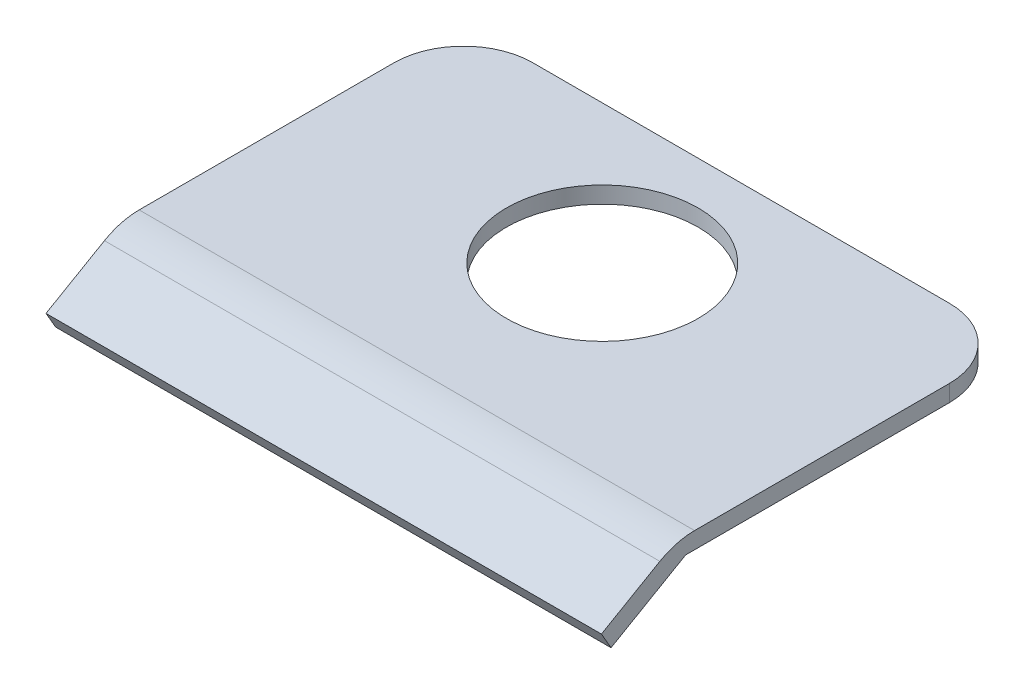
ISO-10303-21;
HEADER;
FILE_DESCRIPTION(('STEP AP214'),'2;1');
FILE_NAME('part.step','',(''),(''),'','','');
FILE_SCHEMA(('AUTOMOTIVE_DESIGN { 1 0 10303 214 1 1 1 1 }'));
ENDSEC;
DATA;
#1=APPLICATION_CONTEXT('core data for automotive mechanical design processes');
#2=APPLICATION_PROTOCOL_DEFINITION('international standard','automotive_design',2000,#1);
#3=PRODUCT_CONTEXT('',#1,'mechanical');
#4=PRODUCT('Part','Part','',(#3));
#5=PRODUCT_RELATED_PRODUCT_CATEGORY('part','',(#4));
#6=PRODUCT_DEFINITION_FORMATION('','',#4);
#7=PRODUCT_DEFINITION_CONTEXT('part definition',#1,'design');
#8=PRODUCT_DEFINITION('design','',#6,#7);
#9=PRODUCT_DEFINITION_SHAPE('','',#8);
#10=(LENGTH_UNIT() NAMED_UNIT(*) SI_UNIT(.MILLI.,.METRE.));
#11=(NAMED_UNIT(*) PLANE_ANGLE_UNIT() SI_UNIT($,.RADIAN.));
#12=(NAMED_UNIT(*) SI_UNIT($,.STERADIAN.) SOLID_ANGLE_UNIT());
#13=UNCERTAINTY_MEASURE_WITH_UNIT(LENGTH_MEASURE(1.E-05),#10,'distance_accuracy_value','');
#14=(GEOMETRIC_REPRESENTATION_CONTEXT(3) GLOBAL_UNCERTAINTY_ASSIGNED_CONTEXT((#13)) GLOBAL_UNIT_ASSIGNED_CONTEXT((#10,
#11,#12)) REPRESENTATION_CONTEXT('',''));
#15=CARTESIAN_POINT('',(0.,0.,0.));
#16=DIRECTION('',(0.,0.,1.));
#17=DIRECTION('',(1.,0.,0.));
#18=AXIS2_PLACEMENT_3D('',#15,#16,#17);
#19=CARTESIAN_POINT('',(0.,1.524,0.));
#20=DIRECTION('',(0.,1.,0.));
#21=DIRECTION('',(0.,0.,1.));
#22=AXIS2_PLACEMENT_3D('',#19,#20,#21);
#23=PLANE('',#22);
#24=DIRECTION('',(0.,0.,1.));
#25=VECTOR('',#24,1.);
#26=CARTESIAN_POINT('',(-25.4,1.524,-15.24));
#27=LINE('',#26,#25);
#28=CARTESIAN_POINT('',(-25.4,1.524,-8.89));
#29=VERTEX_POINT('',#28);
#30=CARTESIAN_POINT('',(-25.4,1.524,14.4184044383074));
#31=VERTEX_POINT('',#30);
#32=EDGE_CURVE('E164',#29,#31,#27,.T.);
#33=ORIENTED_EDGE('',*,*,#32,.T.);
#34=DIRECTION('',(-1.,0.,0.));
#35=VECTOR('',#34,1.);
#36=CARTESIAN_POINT('',(0.,1.524,14.4184044383074));
#37=LINE('',#36,#35);
#38=CARTESIAN_POINT('',(25.4,1.524,14.4184044383073));
#39=VERTEX_POINT('',#38);
#40=EDGE_CURVE('E179',#31,#39,#37,.F.);
#41=ORIENTED_EDGE('',*,*,#40,.T.);
#42=DIRECTION('',(0.,0.,-1.));
#43=VECTOR('',#42,1.);
#44=CARTESIAN_POINT('',(25.4,1.524,-15.24));
#45=LINE('',#44,#43);
#46=CARTESIAN_POINT('',(25.4,1.524,-8.89000000000001));
#47=VERTEX_POINT('',#46);
#48=EDGE_CURVE('E132',#39,#47,#45,.T.);
#49=ORIENTED_EDGE('',*,*,#48,.T.);
#50=CARTESIAN_POINT('',(19.05,1.524,-8.89));
#51=DIRECTION('',(0.,1.,0.));
#52=DIRECTION('',(0.,0.,1.));
#53=AXIS2_PLACEMENT_3D('',#50,#51,#52);
#54=CIRCLE('',#53,6.35);
#55=CARTESIAN_POINT('',(19.05,1.524,-15.24));
#56=VERTEX_POINT('',#55);
#57=EDGE_CURVE('E175',#47,#56,#54,.T.);
#58=ORIENTED_EDGE('',*,*,#57,.T.);
#59=DIRECTION('',(-1.,0.,0.));
#60=VECTOR('',#59,1.);
#61=CARTESIAN_POINT('',(-25.4,1.524,-15.24));
#62=LINE('',#61,#60);
#63=CARTESIAN_POINT('',(-19.05,1.524,-15.24));
#64=VERTEX_POINT('',#63);
#65=EDGE_CURVE('E161',#56,#64,#62,.T.);
#66=ORIENTED_EDGE('',*,*,#65,.T.);
#67=CARTESIAN_POINT('',(-19.05,1.524,-8.89));
#68=DIRECTION('',(0.,1.,0.));
#69=DIRECTION('',(0.,0.,1.));
#70=AXIS2_PLACEMENT_3D('',#67,#68,#69);
#71=CIRCLE('',#70,6.35);
#72=EDGE_CURVE('E177',#64,#29,#71,.T.);
#73=ORIENTED_EDGE('',*,*,#72,.T.);
#74=EDGE_LOOP('',(#33,#41,#49,#58,#66,#73));
#75=FACE_BOUND('',#74,.T.);
#76=CARTESIAN_POINT('',(0.,1.524,-2.54));
#77=DIRECTION('',(0.,1.,0.));
#78=DIRECTION('',(0.,0.,1.));
#79=AXIS2_PLACEMENT_3D('',#76,#77,#78);
#80=CIRCLE('',#79,8.76299999999999);
#81=CARTESIAN_POINT('',(0.,1.524,-11.303));
#82=VERTEX_POINT('',#81);
#83=EDGE_CURVE('E154',#82,#82,#80,.T.);
#84=ORIENTED_EDGE('',*,*,#83,.F.);
#85=EDGE_LOOP('',(#84));
#86=FACE_BOUND('',#85,.T.);
#87=ADVANCED_FACE('F39',(#75,#86),#23,.T.);
#88=CARTESIAN_POINT('',(0.,0.,0.));
#89=DIRECTION('',(0.,1.,0.));
#90=DIRECTION('',(0.,0.,1.));
#91=AXIS2_PLACEMENT_3D('',#88,#89,#90);
#92=PLANE('',#91);
#93=DIRECTION('',(0.,0.,1.));
#94=VECTOR('',#93,1.);
#95=CARTESIAN_POINT('',(-25.4,0.,-15.24));
#96=LINE('',#95,#94);
#97=CARTESIAN_POINT('',(-25.4,0.,-8.89));
#98=VERTEX_POINT('',#97);
#99=CARTESIAN_POINT('',(-25.4,0.,15.24));
#100=VERTEX_POINT('',#99);
#101=EDGE_CURVE('E111',#98,#100,#96,.T.);
#102=ORIENTED_EDGE('',*,*,#101,.F.);
#103=CARTESIAN_POINT('',(-19.05,0.,-8.89));
#104=DIRECTION('',(0.,1.,0.));
#105=DIRECTION('',(0.,0.,1.));
#106=AXIS2_PLACEMENT_3D('',#103,#104,#105);
#107=CIRCLE('',#106,6.35);
#108=CARTESIAN_POINT('',(-19.05,0.,-15.24));
#109=VERTEX_POINT('',#108);
#110=EDGE_CURVE('E54',#98,#109,#107,.F.);
#111=ORIENTED_EDGE('',*,*,#110,.T.);
#112=DIRECTION('',(-1.,0.,0.));
#113=VECTOR('',#112,1.);
#114=CARTESIAN_POINT('',(-25.4,0.,-15.24));
#115=LINE('',#114,#113);
#116=CARTESIAN_POINT('',(19.05,0.,-15.24));
#117=VERTEX_POINT('',#116);
#118=EDGE_CURVE('E122',#117,#109,#115,.T.);
#119=ORIENTED_EDGE('',*,*,#118,.F.);
#120=CARTESIAN_POINT('',(19.05,0.,-8.89));
#121=DIRECTION('',(0.,1.,0.));
#122=DIRECTION('',(0.,0.,1.));
#123=AXIS2_PLACEMENT_3D('',#120,#121,#122);
#124=CIRCLE('',#123,6.35);
#125=CARTESIAN_POINT('',(25.4,0.,-8.89000000000001));
#126=VERTEX_POINT('',#125);
#127=EDGE_CURVE('E62',#117,#126,#124,.F.);
#128=ORIENTED_EDGE('',*,*,#127,.T.);
#129=DIRECTION('',(0.,0.,-1.));
#130=VECTOR('',#129,1.);
#131=CARTESIAN_POINT('',(25.4,0.,-15.24));
#132=LINE('',#131,#130);
#133=CARTESIAN_POINT('',(25.4,0.,15.24));
#134=VERTEX_POINT('',#133);
#135=EDGE_CURVE('E128',#134,#126,#132,.T.);
#136=ORIENTED_EDGE('',*,*,#135,.F.);
#137=DIRECTION('',(1.,0.,0.));
#138=VECTOR('',#137,1.);
#139=CARTESIAN_POINT('',(-25.4,0.,15.24));
#140=LINE('',#139,#138);
#141=EDGE_CURVE('E121',#100,#134,#140,.T.);
#142=ORIENTED_EDGE('',*,*,#141,.F.);
#143=EDGE_LOOP('',(#102,#111,#119,#128,#136,#142));
#144=FACE_BOUND('',#143,.T.);
#145=CARTESIAN_POINT('',(0.,0.,-2.54));
#146=DIRECTION('',(0.,1.,0.));
#147=DIRECTION('',(0.,0.,1.));
#148=AXIS2_PLACEMENT_3D('',#145,#146,#147);
#149=CIRCLE('',#148,8.76299999999999);
#150=CARTESIAN_POINT('',(0.,0.,-11.303));
#151=VERTEX_POINT('',#150);
#152=EDGE_CURVE('E153',#151,#151,#149,.T.);
#153=ORIENTED_EDGE('',*,*,#152,.T.);
#154=EDGE_LOOP('',(#153));
#155=FACE_BOUND('',#154,.T.);
#156=ADVANCED_FACE('F125',(#144,#155),#92,.F.);
#157=CARTESIAN_POINT('',(25.4,1.524,-15.24));
#158=DIRECTION('',(-1.,0.,0.));
#159=DIRECTION('',(0.,0.,1.));
#160=AXIS2_PLACEMENT_3D('',#157,#158,#159);
#161=PLANE('',#160);
#162=ORIENTED_EDGE('',*,*,#48,.F.);
#163=CARTESIAN_POINT('',(25.4,-4.826,14.4184044383074));
#164=DIRECTION('',(-1.,0.,0.));
#165=DIRECTION('',(0.,0.,1.));
#166=AXIS2_PLACEMENT_3D('',#163,#164,#165);
#167=CIRCLE('',#166,6.35);
#168=CARTESIAN_POINT('',(25.4,0.673261314031206,17.5934044383073));
#169=VERTEX_POINT('',#168);
#170=EDGE_CURVE('E183',#39,#169,#167,.F.);
#171=ORIENTED_EDGE('',*,*,#170,.T.);
#172=DIRECTION('',(0.,-0.499999999999995,0.866025403784442));
#173=VECTOR('',#172,1.);
#174=CARTESIAN_POINT('',(25.4,1.524,16.119881810245));
#175=LINE('',#174,#173);
#176=CARTESIAN_POINT('',(25.4,-2.41299999999996,22.9389658396437));
#177=VERTEX_POINT('',#176);
#178=EDGE_CURVE('E143',#169,#177,#175,.T.);
#179=ORIENTED_EDGE('',*,*,#178,.T.);
#180=DIRECTION('',(0.,-0.866025403784442,-0.499999999999995));
#181=VECTOR('',#180,1.);
#182=CARTESIAN_POINT('',(25.4,-3.93699999999995,22.0590840293987));
#183=LINE('',#182,#181);
#184=CARTESIAN_POINT('',(25.4,-3.93699999999995,22.0590840293987));
#185=VERTEX_POINT('',#184);
#186=EDGE_CURVE('E149',#177,#185,#183,.T.);
#187=ORIENTED_EDGE('',*,*,#186,.T.);
#188=DIRECTION('',(0.,0.499999999999994,-0.866025403784442));
#189=VECTOR('',#188,1.);
#190=CARTESIAN_POINT('',(25.4,0.,15.24));
#191=LINE('',#190,#189);
#192=EDGE_CURVE('E151',#185,#134,#191,.T.);
#193=ORIENTED_EDGE('',*,*,#192,.T.);
#194=ORIENTED_EDGE('',*,*,#135,.T.);
#195=DIRECTION('',(0.,-1.,0.));
#196=VECTOR('',#195,1.);
#197=CARTESIAN_POINT('',(25.4,1.524,-8.89));
#198=LINE('',#197,#196);
#199=EDGE_CURVE('E181',#126,#47,#198,.F.);
#200=ORIENTED_EDGE('',*,*,#199,.T.);
#201=EDGE_LOOP('',(#162,#171,#179,#187,#193,#194,#200));
#202=FACE_BOUND('',#201,.T.);
#203=ADVANCED_FACE('F193',(#202),#161,.F.);
#204=CARTESIAN_POINT('',(-25.4,1.524,-15.24));
#205=DIRECTION('',(0.,0.,1.));
#206=DIRECTION('',(1.,0.,0.));
#207=AXIS2_PLACEMENT_3D('',#204,#205,#206);
#208=PLANE('',#207);
#209=ORIENTED_EDGE('',*,*,#118,.T.);
#210=DIRECTION('',(0.,-1.,0.));
#211=VECTOR('',#210,1.);
#212=CARTESIAN_POINT('',(-19.05,1.524,-15.24));
#213=LINE('',#212,#211);
#214=EDGE_CURVE('E11',#109,#64,#213,.F.);
#215=ORIENTED_EDGE('',*,*,#214,.T.);
#216=ORIENTED_EDGE('',*,*,#65,.F.);
#217=DIRECTION('',(0.,-1.,0.));
#218=VECTOR('',#217,1.);
#219=CARTESIAN_POINT('',(19.05,1.524,-15.24));
#220=LINE('',#219,#218);
#221=EDGE_CURVE('E47',#56,#117,#220,.T.);
#222=ORIENTED_EDGE('',*,*,#221,.T.);
#223=EDGE_LOOP('',(#209,#215,#216,#222));
#224=FACE_BOUND('',#223,.T.);
#225=ADVANCED_FACE('F188',(#224),#208,.F.);
#226=CARTESIAN_POINT('',(-25.4,1.524,-15.24));
#227=DIRECTION('',(1.,0.,0.));
#228=DIRECTION('',(0.,0.,-1.));
#229=AXIS2_PLACEMENT_3D('',#226,#227,#228);
#230=PLANE('',#229);
#231=DIRECTION('',(0.,0.499999999999995,-0.866025403784442));
#232=VECTOR('',#231,1.);
#233=CARTESIAN_POINT('',(-25.4,1.524,16.119881810245));
#234=LINE('',#233,#232);
#235=CARTESIAN_POINT('',(-25.4,-2.41299999999996,22.9389658396437));
#236=VERTEX_POINT('',#235);
#237=CARTESIAN_POINT('',(-25.4,0.673261314031205,17.5934044383073));
#238=VERTEX_POINT('',#237);
#239=EDGE_CURVE('E140',#236,#238,#234,.T.);
#240=ORIENTED_EDGE('',*,*,#239,.T.);
#241=CARTESIAN_POINT('',(-25.4,-4.826,14.4184044383074));
#242=DIRECTION('',(1.,0.,0.));
#243=DIRECTION('',(0.,0.,-1.));
#244=AXIS2_PLACEMENT_3D('',#241,#242,#243);
#245=CIRCLE('',#244,6.35);
#246=EDGE_CURVE('E173',#238,#31,#245,.F.);
#247=ORIENTED_EDGE('',*,*,#246,.T.);
#248=ORIENTED_EDGE('',*,*,#32,.F.);
#249=DIRECTION('',(0.,-1.,0.));
#250=VECTOR('',#249,1.);
#251=CARTESIAN_POINT('',(-25.4,1.524,-8.89));
#252=LINE('',#251,#250);
#253=EDGE_CURVE('E120',#29,#98,#252,.T.);
#254=ORIENTED_EDGE('',*,*,#253,.T.);
#255=ORIENTED_EDGE('',*,*,#101,.T.);
#256=DIRECTION('',(0.,-0.499999999999994,0.866025403784442));
#257=VECTOR('',#256,1.);
#258=CARTESIAN_POINT('',(-25.4,0.,15.24));
#259=LINE('',#258,#257);
#260=CARTESIAN_POINT('',(-25.4,-3.93699999999995,22.0590840293987));
#261=VERTEX_POINT('',#260);
#262=EDGE_CURVE('E117',#100,#261,#259,.T.);
#263=ORIENTED_EDGE('',*,*,#262,.T.);
#264=DIRECTION('',(0.,0.866025403784442,0.499999999999994));
#265=VECTOR('',#264,1.);
#266=CARTESIAN_POINT('',(-25.4,-3.93699999999995,22.0590840293987));
#267=LINE('',#266,#265);
#268=EDGE_CURVE('E138',#261,#236,#267,.T.);
#269=ORIENTED_EDGE('',*,*,#268,.T.);
#270=EDGE_LOOP('',(#240,#247,#248,#254,#255,#263,#269));
#271=FACE_BOUND('',#270,.T.);
#272=ADVANCED_FACE('F114',(#271),#230,.F.);
#273=CARTESIAN_POINT('',(0.,1.524,-2.54));
#274=DIRECTION('',(0.,-1.,0.));
#275=DIRECTION('',(0.,0.,-1.));
#276=AXIS2_PLACEMENT_3D('',#273,#274,#275);
#277=CYLINDRICAL_SURFACE('',#276,8.76299999999999);
#278=CARTESIAN_POINT('',(0.,1.524,-11.303));
#279=CARTESIAN_POINT('',(0.,1.508125,-11.303));
#280=CARTESIAN_POINT('',(0.,1.49225,-11.303));
#281=CARTESIAN_POINT('',(0.,1.4605,-11.303));
#282=CARTESIAN_POINT('',(0.,1.444625,-11.303));
#283=CARTESIAN_POINT('',(0.,1.412875,-11.303));
#284=CARTESIAN_POINT('',(0.,1.397,-11.303));
#285=CARTESIAN_POINT('',(0.,1.36525,-11.303));
#286=CARTESIAN_POINT('',(0.,1.349375,-11.303));
#287=CARTESIAN_POINT('',(0.,1.317625,-11.303));
#288=CARTESIAN_POINT('',(0.,1.30175,-11.303));
#289=CARTESIAN_POINT('',(0.,1.27,-11.303));
#290=CARTESIAN_POINT('',(0.,1.254125,-11.303));
#291=CARTESIAN_POINT('',(0.,1.222375,-11.303));
#292=CARTESIAN_POINT('',(0.,1.2065,-11.303));
#293=CARTESIAN_POINT('',(0.,1.17475,-11.303));
#294=CARTESIAN_POINT('',(0.,1.158875,-11.303));
#295=CARTESIAN_POINT('',(0.,1.127125,-11.303));
#296=CARTESIAN_POINT('',(0.,1.11125,-11.303));
#297=CARTESIAN_POINT('',(0.,1.0795,-11.303));
#298=CARTESIAN_POINT('',(0.,1.063625,-11.303));
#299=CARTESIAN_POINT('',(0.,1.031875,-11.303));
#300=CARTESIAN_POINT('',(0.,1.016,-11.303));
#301=CARTESIAN_POINT('',(0.,0.98425,-11.303));
#302=CARTESIAN_POINT('',(0.,0.968375,-11.303));
#303=CARTESIAN_POINT('',(0.,0.936625,-11.303));
#304=CARTESIAN_POINT('',(0.,0.92075,-11.303));
#305=CARTESIAN_POINT('',(0.,0.889,-11.303));
#306=CARTESIAN_POINT('',(0.,0.873125,-11.303));
#307=CARTESIAN_POINT('',(0.,0.841375,-11.303));
#308=CARTESIAN_POINT('',(0.,0.8255,-11.303));
#309=CARTESIAN_POINT('',(0.,0.79375,-11.303));
#310=CARTESIAN_POINT('',(0.,0.777875,-11.303));
#311=CARTESIAN_POINT('',(0.,0.746125,-11.303));
#312=CARTESIAN_POINT('',(0.,0.73025,-11.303));
#313=CARTESIAN_POINT('',(0.,0.6985,-11.303));
#314=CARTESIAN_POINT('',(0.,0.682625,-11.303));
#315=CARTESIAN_POINT('',(0.,0.650875,-11.303));
#316=CARTESIAN_POINT('',(0.,0.635,-11.303));
#317=CARTESIAN_POINT('',(0.,0.60325,-11.303));
#318=CARTESIAN_POINT('',(0.,0.587375,-11.303));
#319=CARTESIAN_POINT('',(0.,0.555625,-11.303));
#320=CARTESIAN_POINT('',(0.,0.53975,-11.303));
#321=CARTESIAN_POINT('',(0.,0.508,-11.303));
#322=CARTESIAN_POINT('',(0.,0.492125,-11.303));
#323=CARTESIAN_POINT('',(0.,0.460375,-11.303));
#324=CARTESIAN_POINT('',(0.,0.4445,-11.303));
#325=CARTESIAN_POINT('',(0.,0.41275,-11.303));
#326=CARTESIAN_POINT('',(0.,0.396875,-11.303));
#327=CARTESIAN_POINT('',(0.,0.365125,-11.303));
#328=CARTESIAN_POINT('',(0.,0.34925,-11.303));
#329=CARTESIAN_POINT('',(0.,0.3175,-11.303));
#330=CARTESIAN_POINT('',(0.,0.301625,-11.303));
#331=CARTESIAN_POINT('',(0.,0.269875,-11.303));
#332=CARTESIAN_POINT('',(0.,0.254,-11.303));
#333=CARTESIAN_POINT('',(0.,0.22225,-11.303));
#334=CARTESIAN_POINT('',(0.,0.206375,-11.303));
#335=CARTESIAN_POINT('',(0.,0.174625,-11.303));
#336=CARTESIAN_POINT('',(0.,0.15875,-11.303));
#337=CARTESIAN_POINT('',(0.,0.127,-11.303));
#338=CARTESIAN_POINT('',(0.,0.111125,-11.303));
#339=CARTESIAN_POINT('',(0.,0.079375,-11.303));
#340=CARTESIAN_POINT('',(0.,0.0635,-11.303));
#341=CARTESIAN_POINT('',(0.,0.0317499999999999,-11.303));
#342=CARTESIAN_POINT('',(0.,0.015875,-11.303));
#343=CARTESIAN_POINT('',(0.,0.,-11.303));
#344=B_SPLINE_CURVE_WITH_KNOTS('',3,(#278,#279,#280,#281,#282,#283,#284,#285,#286,#287,#288,
#289,#290,#291,#292,#293,#294,#295,#296,#297,#298,#299,#300,#301,#302,#303,#304,#305,#306,#307,
#308,#309,#310,#311,#312,#313,#314,#315,#316,#317,#318,#319,#320,#321,#322,#323,#324,#325,#326,
#327,#328,#329,#330,#331,#332,#333,#334,#335,#336,#337,#338,#339,#340,#341,#342,#343),
.UNSPECIFIED.,.F.,.F.,(4,2,2,2,2,2,2,2,2,2,2,2,2,2,2,2,2,2,2,2,2,2,2,2,2,2,2,2,2,2,2,2,4),(0.,
0.0476250000000001,0.0952500000000001,0.142875,0.1905,0.238125,0.28575,0.333375,0.381,0.428625,
0.47625,0.523875,0.5715,0.619125,0.66675,0.714375,0.762,0.809625,0.85725,0.904875,0.9525,
1.000125,1.04775,1.095375,1.143,1.190625,1.23825,1.285875,1.3335,1.381125,1.42875,1.476375,
1.524),.UNSPECIFIED.);
#345=EDGE_CURVE('BSEAM218',#82,#151,#344,.T.);
#346=ORIENTED_EDGE('',*,*,#83,.T.);
#347=ORIENTED_EDGE('',*,*,#152,.F.);
#348=ORIENTED_EDGE('',*,*,#345,.T.);
#349=ORIENTED_EDGE('',*,*,#345,.F.);
#350=EDGE_LOOP('',(#346,#348,#347,#349));
#351=FACE_BOUND('',#350,.T.);
#352=ADVANCED_FACE('F218',(#351),#277,.F.);
#353=CARTESIAN_POINT('',(34.8390993214395,1.524,16.119881810245));
#354=DIRECTION('',(0.,0.866025403784442,0.499999999999995));
#355=DIRECTION('',(0.,-0.499999999999995,0.866025403784442));
#356=AXIS2_PLACEMENT_3D('',#353,#354,#355);
#357=PLANE('',#356);
#358=ORIENTED_EDGE('',*,*,#178,.F.);
#359=DIRECTION('',(-1.,0.,0.));
#360=VECTOR('',#359,1.);
#361=CARTESIAN_POINT('',(34.8390993214395,0.673261314031205,17.5934044383073));
#362=LINE('',#361,#360);
#363=EDGE_CURVE('E167',#169,#238,#362,.T.);
#364=ORIENTED_EDGE('',*,*,#363,.T.);
#365=ORIENTED_EDGE('',*,*,#239,.F.);
#366=DIRECTION('',(-1.,0.,0.));
#367=VECTOR('',#366,1.);
#368=CARTESIAN_POINT('',(34.8390993214395,-2.41299999999996,22.9389658396437));
#369=LINE('',#368,#367);
#370=EDGE_CURVE('E147',#177,#236,#369,.T.);
#371=ORIENTED_EDGE('',*,*,#370,.F.);
#372=EDGE_LOOP('',(#358,#364,#365,#371));
#373=FACE_BOUND('',#372,.T.);
#374=ADVANCED_FACE('F205',(#373),#357,.T.);
#375=CARTESIAN_POINT('',(34.8390993214395,-3.93699999999995,22.0590840293987));
#376=DIRECTION('',(0.,-0.499999999999994,0.866025403784442));
#377=DIRECTION('',(0.,-0.866025403784442,-0.499999999999995));
#378=AXIS2_PLACEMENT_3D('',#375,#376,#377);
#379=PLANE('',#378);
#380=ORIENTED_EDGE('',*,*,#186,.F.);
#381=ORIENTED_EDGE('',*,*,#370,.T.);
#382=ORIENTED_EDGE('',*,*,#268,.F.);
#383=DIRECTION('',(-1.,0.,0.));
#384=VECTOR('',#383,1.);
#385=CARTESIAN_POINT('',(34.8390993214395,-3.93699999999995,22.0590840293987));
#386=LINE('',#385,#384);
#387=EDGE_CURVE('E136',#185,#261,#386,.T.);
#388=ORIENTED_EDGE('',*,*,#387,.F.);
#389=EDGE_LOOP('',(#380,#381,#382,#388));
#390=FACE_BOUND('',#389,.T.);
#391=ADVANCED_FACE('F209',(#390),#379,.T.);
#392=CARTESIAN_POINT('',(34.8390993214395,0.,15.24));
#393=DIRECTION('',(0.,-0.866025403784442,-0.499999999999994));
#394=DIRECTION('',(0.,0.499999999999994,-0.866025403784442));
#395=AXIS2_PLACEMENT_3D('',#392,#393,#394);
#396=PLANE('',#395);
#397=ORIENTED_EDGE('',*,*,#192,.F.);
#398=ORIENTED_EDGE('',*,*,#387,.T.);
#399=ORIENTED_EDGE('',*,*,#262,.F.);
#400=ORIENTED_EDGE('',*,*,#141,.T.);
#401=EDGE_LOOP('',(#397,#398,#399,#400));
#402=FACE_BOUND('',#401,.T.);
#403=ADVANCED_FACE('F134',(#402),#396,.T.);
#404=CARTESIAN_POINT('',(34.8390993214395,-4.826,14.4184044383074));
#405=DIRECTION('',(-1.,0.,0.));
#406=DIRECTION('',(0.,0.,1.));
#407=AXIS2_PLACEMENT_3D('',#404,#405,#406);
#408=CYLINDRICAL_SURFACE('',#407,6.35);
#409=ORIENTED_EDGE('',*,*,#170,.F.);
#410=ORIENTED_EDGE('',*,*,#40,.F.);
#411=ORIENTED_EDGE('',*,*,#246,.F.);
#412=ORIENTED_EDGE('',*,*,#363,.F.);
#413=EDGE_LOOP('',(#409,#410,#411,#412));
#414=FACE_BOUND('',#413,.T.);
#415=ADVANCED_FACE('F202',(#414),#408,.T.);
#416=CARTESIAN_POINT('',(-19.05,1.524,-8.89));
#417=DIRECTION('',(0.,-1.,0.));
#418=DIRECTION('',(0.,0.,-1.));
#419=AXIS2_PLACEMENT_3D('',#416,#417,#418);
#420=CYLINDRICAL_SURFACE('',#419,6.35);
#421=ORIENTED_EDGE('',*,*,#72,.F.);
#422=ORIENTED_EDGE('',*,*,#214,.F.);
#423=ORIENTED_EDGE('',*,*,#110,.F.);
#424=ORIENTED_EDGE('',*,*,#253,.F.);
#425=EDGE_LOOP('',(#421,#422,#423,#424));
#426=FACE_BOUND('',#425,.T.);
#427=ADVANCED_FACE('F235',(#426),#420,.T.);
#428=CARTESIAN_POINT('',(19.05,1.524,-8.89));
#429=DIRECTION('',(0.,-1.,0.));
#430=DIRECTION('',(0.,0.,-1.));
#431=AXIS2_PLACEMENT_3D('',#428,#429,#430);
#432=CYLINDRICAL_SURFACE('',#431,6.35);
#433=ORIENTED_EDGE('',*,*,#57,.F.);
#434=ORIENTED_EDGE('',*,*,#199,.F.);
#435=ORIENTED_EDGE('',*,*,#127,.F.);
#436=ORIENTED_EDGE('',*,*,#221,.F.);
#437=EDGE_LOOP('',(#433,#434,#435,#436));
#438=FACE_BOUND('',#437,.T.);
#439=ADVANCED_FACE('F41',(#438),#432,.T.);
#440=CLOSED_SHELL('',(#87,#156,#203,#225,#272,#352,#374,#391,#403,#415,#427,#439));
#441=MANIFOLD_SOLID_BREP('B2',#440);
#442=ADVANCED_BREP_SHAPE_REPRESENTATION('',(#18,#441),#14);
#443=SHAPE_DEFINITION_REPRESENTATION(#9,#442);
ENDSEC;
END-ISO-10303-21;
